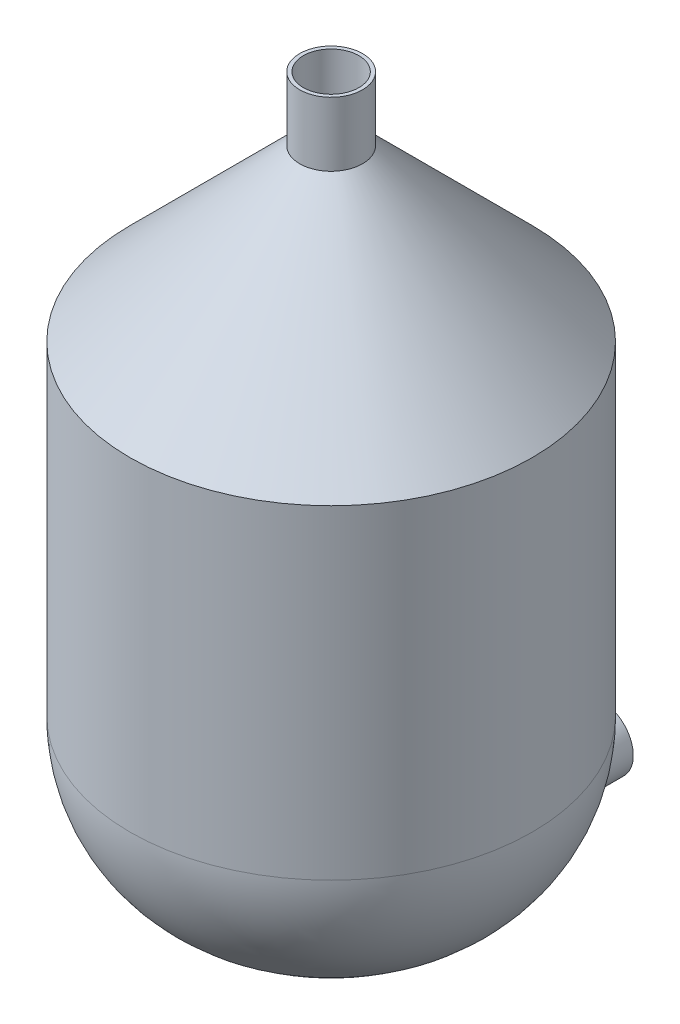
ISO-10303-21;
HEADER;
FILE_DESCRIPTION(('STEP AP214'),'2;1');
FILE_NAME('part.step','',(''),(''),'','','');
FILE_SCHEMA(('AUTOMOTIVE_DESIGN { 1 0 10303 214 1 1 1 1 }'));
ENDSEC;
DATA;
#1=APPLICATION_CONTEXT('core data for automotive mechanical design processes');
#2=APPLICATION_PROTOCOL_DEFINITION('international standard','automotive_design',2000,#1);
#3=PRODUCT_CONTEXT('',#1,'mechanical');
#4=PRODUCT('Part','Part','',(#3));
#5=PRODUCT_RELATED_PRODUCT_CATEGORY('part','',(#4));
#6=PRODUCT_DEFINITION_FORMATION('','',#4);
#7=PRODUCT_DEFINITION_CONTEXT('part definition',#1,'design');
#8=PRODUCT_DEFINITION('design','',#6,#7);
#9=PRODUCT_DEFINITION_SHAPE('','',#8);
#10=(LENGTH_UNIT() NAMED_UNIT(*) SI_UNIT(.MILLI.,.METRE.));
#11=(NAMED_UNIT(*) PLANE_ANGLE_UNIT() SI_UNIT($,.RADIAN.));
#12=(NAMED_UNIT(*) SI_UNIT($,.STERADIAN.) SOLID_ANGLE_UNIT());
#13=UNCERTAINTY_MEASURE_WITH_UNIT(LENGTH_MEASURE(1.E-05),#10,'distance_accuracy_value','');
#14=(GEOMETRIC_REPRESENTATION_CONTEXT(3) GLOBAL_UNCERTAINTY_ASSIGNED_CONTEXT((#13)) GLOBAL_UNIT_ASSIGNED_CONTEXT((#10,
#11,#12)) REPRESENTATION_CONTEXT('',''));
#15=CARTESIAN_POINT('',(0.,0.,0.));
#16=DIRECTION('',(0.,0.,1.));
#17=DIRECTION('',(1.,0.,0.));
#18=AXIS2_PLACEMENT_3D('',#15,#16,#17);
#19=CARTESIAN_POINT('',(3.,51.1307575757577,0.));
#20=DIRECTION('',(0.,-1.,0.));
#21=DIRECTION('',(0.,0.,-1.));
#22=AXIS2_PLACEMENT_3D('',#19,#20,#21);
#23=PLANE('',#22);
#24=CARTESIAN_POINT('',(0.,51.1307575757577,0.));
#25=DIRECTION('',(0.,1.,0.));
#26=DIRECTION('',(0.,0.,1.));
#27=AXIS2_PLACEMENT_3D('',#24,#25,#26);
#28=CIRCLE('',#27,3.);
#29=CARTESIAN_POINT('',(0.,51.1307575757577,3.));
#30=VERTEX_POINT('',#29);
#31=EDGE_CURVE('E139',#30,#30,#28,.T.);
#32=ORIENTED_EDGE('',*,*,#31,.F.);
#33=EDGE_LOOP('',(#32));
#34=FACE_BOUND('',#33,.T.);
#35=CARTESIAN_POINT('',(0.,51.1307575757577,0.));
#36=DIRECTION('',(0.,1.,0.));
#37=DIRECTION('',(0.,0.,1.));
#38=AXIS2_PLACEMENT_3D('',#35,#36,#37);
#39=CIRCLE('',#38,3.395);
#40=CARTESIAN_POINT('',(0.,51.1307575757577,3.395));
#41=VERTEX_POINT('',#40);
#42=EDGE_CURVE('E52',#41,#41,#39,.T.);
#43=ORIENTED_EDGE('',*,*,#42,.T.);
#44=EDGE_LOOP('',(#43));
#45=FACE_BOUND('',#44,.T.);
#46=ADVANCED_FACE('F49',(#34,#45),#23,.F.);
#47=CARTESIAN_POINT('',(0.,65.9453030303031,0.));
#48=DIRECTION('',(0.,1.,0.));
#49=DIRECTION('',(0.,0.,1.));
#50=AXIS2_PLACEMENT_3D('',#47,#48,#49);
#51=CYLINDRICAL_SURFACE('',#50,3.395);
#52=ORIENTED_EDGE('',*,*,#42,.F.);
#53=EDGE_LOOP('',(#52));
#54=FACE_BOUND('',#53,.T.);
#55=CARTESIAN_POINT('',(0.,44.2018253876231,0.));
#56=DIRECTION('',(0.,1.,0.));
#57=DIRECTION('',(0.,0.,1.));
#58=AXIS2_PLACEMENT_3D('',#55,#56,#57);
#59=CIRCLE('',#58,3.395);
#60=CARTESIAN_POINT('',(0.,44.2018253876231,-3.395));
#61=VERTEX_POINT('',#60);
#62=EDGE_CURVE('E62',#61,#61,#59,.T.);
#63=ORIENTED_EDGE('',*,*,#62,.T.);
#64=EDGE_LOOP('',(#63));
#65=FACE_BOUND('',#64,.T.);
#66=ADVANCED_FACE('F129',(#54,#65),#51,.T.);
#67=CARTESIAN_POINT('',(0.,25.8625558773645,0.));
#68=DIRECTION('',(0.,-1.,0.));
#69=DIRECTION('',(0.,0.,-1.));
#70=AXIS2_PLACEMENT_3D('',#67,#68,#69);
#71=CONICAL_SURFACE('',#70,21.7342695102586,0.785398163397447);
#72=CARTESIAN_POINT('',(0.,25.8625558773645,0.));
#73=DIRECTION('',(0.,1.,0.));
#74=DIRECTION('',(0.,0.,1.));
#75=AXIS2_PLACEMENT_3D('',#72,#73,#74);
#76=CIRCLE('',#75,21.7342695102586);
#77=CARTESIAN_POINT('',(0.,25.8625558773645,-21.7342695102586));
#78=VERTEX_POINT('',#77);
#79=EDGE_CURVE('E146',#78,#78,#76,.T.);
#80=CARTESIAN_POINT('',(0.,44.2018253876231,-3.395));
#81=CARTESIAN_POINT('',(0.,44.0107913302246,-3.58603405739853));
#82=CARTESIAN_POINT('',(0.,43.8197572728261,-3.77706811479705));
#83=CARTESIAN_POINT('',(0.,43.437689158029,-4.15913622959411));
#84=CARTESIAN_POINT('',(0.,43.2466551006305,-4.35017028699264));
#85=CARTESIAN_POINT('',(0.,42.8645869858334,-4.73223840178969));
#86=CARTESIAN_POINT('',(0.,42.6735529284349,-4.92327245918821));
#87=CARTESIAN_POINT('',(0.,42.2914848136379,-5.30534057398527));
#88=CARTESIAN_POINT('',(0.,42.1004507562393,-5.49637463138379));
#89=CARTESIAN_POINT('',(0.,41.7183826414423,-5.87844274618085));
#90=CARTESIAN_POINT('',(0.,41.5273485840437,-6.06947680357937));
#91=CARTESIAN_POINT('',(0.,41.1452804692467,-6.45154491837643));
#92=CARTESIAN_POINT('',(0.,40.9542464118482,-6.64257897577496));
#93=CARTESIAN_POINT('',(0.,40.5721782970511,-7.02464709057201));
#94=CARTESIAN_POINT('',(0.,40.3811442396526,-7.21568114797053));
#95=CARTESIAN_POINT('',(0.,39.9990761248555,-7.59774926276759));
#96=CARTESIAN_POINT('',(0.,39.808042067457,-7.78878332016611));
#97=CARTESIAN_POINT('',(0.,39.4259739526599,-8.17085143496317));
#98=CARTESIAN_POINT('',(0.,39.2349398952614,-8.36188549236169));
#99=CARTESIAN_POINT('',(0.,38.8528717804644,-8.74395360715875));
#100=CARTESIAN_POINT('',(0.,38.6618377230658,-8.93498766455727));
#101=CARTESIAN_POINT('',(0.,38.2797696082688,-9.31705577935433));
#102=CARTESIAN_POINT('',(0.,38.0887355508703,-9.50808983675285));
#103=CARTESIAN_POINT('',(0.,37.7066674360732,-9.89015795154991));
#104=CARTESIAN_POINT('',(0.,37.5156333786747,-10.0811920089484));
#105=CARTESIAN_POINT('',(0.,37.1335652638776,-10.4632601237455));
#106=CARTESIAN_POINT('',(0.,36.9425312064791,-10.654294181144));
#107=CARTESIAN_POINT('',(0.,36.560463091682,-11.0363622959411));
#108=CARTESIAN_POINT('',(0.,36.3694290342835,-11.2273963533396));
#109=CARTESIAN_POINT('',(0.,35.9873609194864,-11.6094644681366));
#110=CARTESIAN_POINT('',(0.,35.7963268620879,-11.8004985255352));
#111=CARTESIAN_POINT('',(0.,35.4142587472909,-12.1825666403322));
#112=CARTESIAN_POINT('',(0.,35.2232246898923,-12.3736006977308));
#113=CARTESIAN_POINT('',(0.,34.8411565750953,-12.7556688125278));
#114=CARTESIAN_POINT('',(0.,34.6501225176968,-12.9467028699263));
#115=CARTESIAN_POINT('',(0.,34.2680544028997,-13.3287709847234));
#116=CARTESIAN_POINT('',(0.,34.0770203455012,-13.5198050421219));
#117=CARTESIAN_POINT('',(0.,33.6949522307041,-13.901873156919));
#118=CARTESIAN_POINT('',(0.,33.5039181733056,-14.0929072143175));
#119=CARTESIAN_POINT('',(0.,33.1218500585085,-14.4749753291145));
#120=CARTESIAN_POINT('',(0.,32.93081600111,-14.6660093865131));
#121=CARTESIAN_POINT('',(0.,32.548747886313,-15.0480775013101));
#122=CARTESIAN_POINT('',(0.,32.3577138289144,-15.2391115587087));
#123=CARTESIAN_POINT('',(0.,31.9756457141174,-15.6211796735057));
#124=CARTESIAN_POINT('',(0.,31.7846116567189,-15.8122137309042));
#125=CARTESIAN_POINT('',(0.,31.4025435419218,-16.1942818457013));
#126=CARTESIAN_POINT('',(0.,31.2115094845233,-16.3853159030998));
#127=CARTESIAN_POINT('',(0.,30.8294413697262,-16.7673840178969));
#128=CARTESIAN_POINT('',(0.,30.6384073123277,-16.9584180752954));
#129=CARTESIAN_POINT('',(0.,30.2563391975306,-17.3404861900924));
#130=CARTESIAN_POINT('',(0.,30.0653051401321,-17.531520247491));
#131=CARTESIAN_POINT('',(0.,29.6832370253351,-17.913588362288));
#132=CARTESIAN_POINT('',(0.,29.4922029679365,-18.1046224196866));
#133=CARTESIAN_POINT('',(0.,29.1101348531395,-18.4866905344836));
#134=CARTESIAN_POINT('',(0.,28.9191007957409,-18.6777245918821));
#135=CARTESIAN_POINT('',(0.,28.5370326809439,-19.0597927066792));
#136=CARTESIAN_POINT('',(0.,28.3459986235454,-19.2508267640777));
#137=CARTESIAN_POINT('',(0.,27.9639305087483,-19.6328948788748));
#138=CARTESIAN_POINT('',(0.,27.7728964513498,-19.8239289362733));
#139=CARTESIAN_POINT('',(0.,27.3908283365527,-20.2059970510703));
#140=CARTESIAN_POINT('',(0.,27.1997942791542,-20.3970311084689));
#141=CARTESIAN_POINT('',(0.,26.8177261643571,-20.7790992232659));
#142=CARTESIAN_POINT('',(0.,26.6266921069586,-20.9701332806644));
#143=CARTESIAN_POINT('',(0.,26.2446239921616,-21.3522013954615));
#144=CARTESIAN_POINT('',(0.,26.053589934763,-21.54323545286));
#145=CARTESIAN_POINT('',(0.,25.8625558773645,-21.7342695102586));
#146=B_SPLINE_CURVE_WITH_KNOTS('',3,(#80,#81,#82,#83,#84,#85,#86,#87,#88,#89,#90,#91,#92,#93,
#94,#95,#96,#97,#98,#99,#100,#101,#102,#103,#104,#105,#106,#107,#108,#109,#110,#111,#112,#113,
#114,#115,#116,#117,#118,#119,#120,#121,#122,#123,#124,#125,#126,#127,#128,#129,#130,#131,#132,
#133,#134,#135,#136,#137,#138,#139,#140,#141,#142,#143,#144,#145),.UNSPECIFIED.,.F.,.F.,(4,2,2,
2,2,2,2,2,2,2,2,2,2,2,2,2,2,2,2,2,2,2,2,2,2,2,2,2,2,2,2,2,4),(0.,0.810488864544472,
1.62097772908894,2.43146659363341,3.24195545817788,4.05244432272236,4.86293318726683,
5.6734220518113,6.48391091635577,7.29439978090024,8.10488864544471,8.91537750998918,
9.72586637453365,10.5363552390781,11.3468441036226,12.1573329681671,12.9678218327115,
13.778310697256,14.5887995618005,15.399288426345,16.2097772908894,17.0202661554339,
17.8307550199784,18.6412438845228,19.4517327490673,20.2622216136118,21.0727104781563,
21.8831993427007,22.6936882072452,23.5041770717897,24.3146659363341,25.1251548008786,
25.9356436654231),.UNSPECIFIED.);
#147=EDGE_CURVE('BSEAM134',#61,#78,#146,.T.);
#148=ORIENTED_EDGE('',*,*,#62,.F.);
#149=ORIENTED_EDGE('',*,*,#79,.T.);
#150=ORIENTED_EDGE('',*,*,#147,.T.);
#151=ORIENTED_EDGE('',*,*,#147,.F.);
#152=EDGE_LOOP('',(#148,#150,#149,#151));
#153=FACE_BOUND('',#152,.T.);
#154=ADVANCED_FACE('F134',(#153),#71,.T.);
#155=CARTESIAN_POINT('',(0.,65.9453030303031,0.));
#156=DIRECTION('',(0.,1.,0.));
#157=DIRECTION('',(0.,0.,1.));
#158=AXIS2_PLACEMENT_3D('',#155,#156,#157);
#159=CYLINDRICAL_SURFACE('',#158,21.7342695102586);
#160=ORIENTED_EDGE('',*,*,#79,.F.);
#161=EDGE_LOOP('',(#160));
#162=FACE_BOUND('',#161,.T.);
#163=CARTESIAN_POINT('',(0.,-9.19171364061765,0.));
#164=DIRECTION('',(0.,1.,0.));
#165=DIRECTION('',(0.,0.,1.));
#166=AXIS2_PLACEMENT_3D('',#163,#164,#165);
#167=CIRCLE('',#166,21.7342695102586);
#168=CARTESIAN_POINT('',(0.,-9.19171364061765,21.7342695102586));
#169=VERTEX_POINT('',#168);
#170=EDGE_CURVE('E161',#169,#169,#167,.T.);
#171=ORIENTED_EDGE('',*,*,#170,.T.);
#172=EDGE_LOOP('',(#171));
#173=FACE_BOUND('',#172,.T.);
#174=ADVANCED_FACE('F190',(#162,#173),#159,.T.);
#175=CARTESIAN_POINT('',(0.,65.9453030303031,0.));
#176=DIRECTION('',(0.,1.,0.));
#177=DIRECTION('',(0.,0.,1.));
#178=AXIS2_PLACEMENT_3D('',#175,#176,#177);
#179=CYLINDRICAL_SURFACE('',#178,20.);
#180=CARTESIAN_POINT('',(0.,25.1307575757576,0.));
#181=DIRECTION('',(0.,1.,0.));
#182=DIRECTION('',(0.,0.,1.));
#183=AXIS2_PLACEMENT_3D('',#180,#181,#182);
#184=CIRCLE('',#183,20.);
#185=CARTESIAN_POINT('',(0.,25.1307575757576,-20.));
#186=VERTEX_POINT('',#185);
#187=EDGE_CURVE('E149',#186,#186,#184,.T.);
#188=ORIENTED_EDGE('',*,*,#187,.T.);
#189=EDGE_LOOP('',(#188));
#190=FACE_BOUND('',#189,.T.);
#191=CARTESIAN_POINT('',(0.,-9.19171364061765,0.));
#192=DIRECTION('',(0.,1.,0.));
#193=DIRECTION('',(0.,0.,1.));
#194=AXIS2_PLACEMENT_3D('',#191,#192,#193);
#195=CIRCLE('',#194,20.);
#196=CARTESIAN_POINT('',(0.,-9.19171364061765,20.));
#197=VERTEX_POINT('',#196);
#198=EDGE_CURVE('E88',#197,#197,#195,.T.);
#199=ORIENTED_EDGE('',*,*,#198,.F.);
#200=EDGE_LOOP('',(#199));
#201=FACE_BOUND('',#200,.T.);
#202=ADVANCED_FACE('F187',(#190,#201),#179,.F.);
#203=CARTESIAN_POINT('',(0.,42.1307575757577,0.));
#204=DIRECTION('',(0.,-1.,0.));
#205=DIRECTION('',(0.,0.,-1.));
#206=AXIS2_PLACEMENT_3D('',#203,#204,#205);
#207=CONICAL_SURFACE('',#206,3.,0.785398163397447);
#208=CARTESIAN_POINT('',(0.,42.1307575757577,0.));
#209=DIRECTION('',(0.,1.,0.));
#210=DIRECTION('',(0.,0.,1.));
#211=AXIS2_PLACEMENT_3D('',#208,#209,#210);
#212=CIRCLE('',#211,3.);
#213=CARTESIAN_POINT('',(0.,42.1307575757576,-3.00000000000001));
#214=VERTEX_POINT('',#213);
#215=EDGE_CURVE('E155',#214,#214,#212,.T.);
#216=CARTESIAN_POINT('',(0.,25.1307575757576,-20.));
#217=CARTESIAN_POINT('',(0.,25.3078409090909,-19.8229166666667));
#218=CARTESIAN_POINT('',(0.,25.4849242424243,-19.6458333333333));
#219=CARTESIAN_POINT('',(0.,25.8390909090909,-19.2916666666667));
#220=CARTESIAN_POINT('',(0.,26.0161742424243,-19.1145833333333));
#221=CARTESIAN_POINT('',(0.,26.3703409090909,-18.7604166666667));
#222=CARTESIAN_POINT('',(0.,26.5474242424243,-18.5833333333333));
#223=CARTESIAN_POINT('',(0.,26.901590909091,-18.2291666666667));
#224=CARTESIAN_POINT('',(0.,27.0786742424243,-18.0520833333333));
#225=CARTESIAN_POINT('',(0.,27.432840909091,-17.6979166666667));
#226=CARTESIAN_POINT('',(0.,27.6099242424243,-17.5208333333333));
#227=CARTESIAN_POINT('',(0.,27.964090909091,-17.1666666666667));
#228=CARTESIAN_POINT('',(0.,28.1411742424243,-16.9895833333333));
#229=CARTESIAN_POINT('',(0.,28.495340909091,-16.6354166666667));
#230=CARTESIAN_POINT('',(0.,28.6724242424243,-16.4583333333333));
#231=CARTESIAN_POINT('',(0.,29.026590909091,-16.1041666666667));
#232=CARTESIAN_POINT('',(0.,29.2036742424243,-15.9270833333333));
#233=CARTESIAN_POINT('',(0.,29.557840909091,-15.5729166666667));
#234=CARTESIAN_POINT('',(0.,29.7349242424243,-15.3958333333333));
#235=CARTESIAN_POINT('',(0.,30.089090909091,-15.0416666666667));
#236=CARTESIAN_POINT('',(0.,30.2661742424243,-14.8645833333333));
#237=CARTESIAN_POINT('',(0.,30.620340909091,-14.5104166666667));
#238=CARTESIAN_POINT('',(0.,30.7974242424243,-14.3333333333333));
#239=CARTESIAN_POINT('',(0.,31.151590909091,-13.9791666666667));
#240=CARTESIAN_POINT('',(0.,31.3286742424243,-13.8020833333333));
#241=CARTESIAN_POINT('',(0.,31.682840909091,-13.4479166666667));
#242=CARTESIAN_POINT('',(0.,31.8599242424243,-13.2708333333333));
#243=CARTESIAN_POINT('',(0.,32.214090909091,-12.9166666666667));
#244=CARTESIAN_POINT('',(0.,32.3911742424243,-12.7395833333333));
#245=CARTESIAN_POINT('',(0.,32.745340909091,-12.3854166666667));
#246=CARTESIAN_POINT('',(0.,32.9224242424243,-12.2083333333333));
#247=CARTESIAN_POINT('',(0.,33.276590909091,-11.8541666666667));
#248=CARTESIAN_POINT('',(0.,33.4536742424243,-11.6770833333333));
#249=CARTESIAN_POINT('',(0.,33.807840909091,-11.3229166666667));
#250=CARTESIAN_POINT('',(0.,33.9849242424243,-11.1458333333333));
#251=CARTESIAN_POINT('',(0.,34.339090909091,-10.7916666666667));
#252=CARTESIAN_POINT('',(0.,34.5161742424243,-10.6145833333333));
#253=CARTESIAN_POINT('',(0.,34.870340909091,-10.2604166666667));
#254=CARTESIAN_POINT('',(0.,35.0474242424243,-10.0833333333333));
#255=CARTESIAN_POINT('',(0.,35.401590909091,-9.72916666666667));
#256=CARTESIAN_POINT('',(0.,35.5786742424243,-9.55208333333333));
#257=CARTESIAN_POINT('',(0.,35.932840909091,-9.19791666666667));
#258=CARTESIAN_POINT('',(0.,36.1099242424243,-9.02083333333334));
#259=CARTESIAN_POINT('',(0.,36.464090909091,-8.66666666666667));
#260=CARTESIAN_POINT('',(0.,36.6411742424243,-8.48958333333334));
#261=CARTESIAN_POINT('',(0.,36.995340909091,-8.13541666666667));
#262=CARTESIAN_POINT('',(0.,37.1724242424243,-7.95833333333334));
#263=CARTESIAN_POINT('',(0.,37.526590909091,-7.60416666666667));
#264=CARTESIAN_POINT('',(0.,37.7036742424243,-7.42708333333334));
#265=CARTESIAN_POINT('',(0.,38.057840909091,-7.07291666666667));
#266=CARTESIAN_POINT('',(0.,38.2349242424243,-6.89583333333334));
#267=CARTESIAN_POINT('',(0.,38.589090909091,-6.54166666666667));
#268=CARTESIAN_POINT('',(0.,38.7661742424243,-6.36458333333334));
#269=CARTESIAN_POINT('',(0.,39.120340909091,-6.01041666666667));
#270=CARTESIAN_POINT('',(0.,39.2974242424243,-5.83333333333334));
#271=CARTESIAN_POINT('',(0.,39.651590909091,-5.47916666666667));
#272=CARTESIAN_POINT('',(0.,39.8286742424243,-5.30208333333334));
#273=CARTESIAN_POINT('',(0.,40.182840909091,-4.94791666666667));
#274=CARTESIAN_POINT('',(0.,40.3599242424243,-4.77083333333334));
#275=CARTESIAN_POINT('',(0.,40.714090909091,-4.41666666666667));
#276=CARTESIAN_POINT('',(0.,40.8911742424243,-4.23958333333334));
#277=CARTESIAN_POINT('',(0.,41.245340909091,-3.88541666666667));
#278=CARTESIAN_POINT('',(0.,41.4224242424243,-3.70833333333334));
#279=CARTESIAN_POINT('',(0.,41.776590909091,-3.35416666666667));
#280=CARTESIAN_POINT('',(0.,41.9536742424243,-3.17708333333334));
#281=CARTESIAN_POINT('',(0.,42.1307575757577,-3.00000000000001));
#282=B_SPLINE_CURVE_WITH_KNOTS('',3,(#216,#217,#218,#219,#220,#221,#222,#223,#224,#225,#226,
#227,#228,#229,#230,#231,#232,#233,#234,#235,#236,#237,#238,#239,#240,#241,#242,#243,#244,#245,
#246,#247,#248,#249,#250,#251,#252,#253,#254,#255,#256,#257,#258,#259,#260,#261,#262,#263,#264,
#265,#266,#267,#268,#269,#270,#271,#272,#273,#274,#275,#276,#277,#278,#279,#280,#281),
.UNSPECIFIED.,.F.,.F.,(4,2,2,2,2,2,2,2,2,2,2,2,2,2,2,2,2,2,2,2,2,2,2,2,2,2,2,2,2,2,2,2,4),(0.,
0.751300955010707,1.50260191002141,2.25390286503212,3.00520382004283,3.75650477505354,
4.50780573006424,5.25910668507495,6.01040764008566,6.76170859509637,7.51300955010707,
8.26431050511778,9.01561146012849,9.7669124151392,10.5182133701499,11.2695143251606,
12.0208152801713,12.772116235182,13.5234171901927,14.2747181452034,15.0260191002141,
15.7773200552249,16.5286210102356,17.2799219652463,18.031222920257,18.7825238752677,
19.5338248302784,20.2851257852891,21.0364267402998,21.7877276953105,22.5390286503212,
23.2903296053319,24.0416305603426),.UNSPECIFIED.);
#283=EDGE_CURVE('BSEAM189',#186,#214,#282,.T.);
#284=ORIENTED_EDGE('',*,*,#187,.F.);
#285=ORIENTED_EDGE('',*,*,#215,.T.);
#286=ORIENTED_EDGE('',*,*,#283,.T.);
#287=ORIENTED_EDGE('',*,*,#283,.F.);
#288=EDGE_LOOP('',(#284,#286,#285,#287));
#289=FACE_BOUND('',#288,.T.);
#290=ADVANCED_FACE('F189',(#289),#207,.F.);
#291=CARTESIAN_POINT('',(0.,65.9453030303031,0.));
#292=DIRECTION('',(0.,1.,0.));
#293=DIRECTION('',(0.,0.,1.));
#294=AXIS2_PLACEMENT_3D('',#291,#292,#293);
#295=CYLINDRICAL_SURFACE('',#294,3.);
#296=ORIENTED_EDGE('',*,*,#215,.F.);
#297=EDGE_LOOP('',(#296));
#298=FACE_BOUND('',#297,.T.);
#299=ORIENTED_EDGE('',*,*,#31,.T.);
#300=EDGE_LOOP('',(#299));
#301=FACE_BOUND('',#300,.T.);
#302=ADVANCED_FACE('F197',(#298,#301),#295,.F.);
#303=CARTESIAN_POINT('',(0.,-9.19171364061764,0.));
#304=DIRECTION('',(0.,1.,0.));
#305=DIRECTION('',(0.,0.,1.));
#306=AXIS2_PLACEMENT_3D('',#303,#304,#305);
#307=DEGENERATE_TOROIDAL_SURFACE('',#306,4.02598315087621,17.7082863593824,.T.);
#308=CARTESIAN_POINT('',(0.322836947717065,-26.6698621329476,-6.86404659915029));
#309=CARTESIAN_POINT('',(0.322826730999457,-26.665990404353,-6.88785263179508));
#310=CARTESIAN_POINT('',(0.31909751557241,-26.6620886288803,-6.91170647292842));
#311=CARTESIAN_POINT('',(0.303898645213899,-26.6541896695304,-6.95976216522943));
#312=CARTESIAN_POINT('',(0.291611335047364,-26.6502304630542,-6.98370557218516));
#313=CARTESIAN_POINT('',(0.259474773363451,-26.6428221070527,-7.02833143781953));
#314=CARTESIAN_POINT('',(0.239176902951558,-26.6394244001929,-7.04869106471734));
#315=CARTESIAN_POINT('',(0.190850942650993,-26.6332843327664,-7.08538609498863));
#316=CARTESIAN_POINT('',(0.162159717240476,-26.630685371171,-7.10084953207015));
#317=CARTESIAN_POINT('',(0.0971080179365582,-26.6265798560888,-7.12524711028965));
#318=CARTESIAN_POINT('',(0.0602418303096733,-26.6252938353159,-7.13286469861505));
#319=CARTESIAN_POINT('',(0.00247844125498503,-26.6247048577121,-7.13635400813412));
#320=CARTESIAN_POINT('',(-0.0182785195160861,-26.6247768220779,-7.13592805523481));
#321=CARTESIAN_POINT('',(-0.0594895680613097,-26.6254837311188,-7.1317382032979));
#322=CARTESIAN_POINT('',(-0.079943316640274,-26.6261192640717,-7.12797081632321));
#323=CARTESIAN_POINT('',(-0.120398872307439,-26.6279778296308,-7.11693981822652));
#324=CARTESIAN_POINT('',(-0.140377609879785,-26.6292147668993,-7.10959345146));
#325=CARTESIAN_POINT('',(-0.17857244835023,-26.6322736661166,-7.09139045599564));
#326=CARTESIAN_POINT('',(-0.196794032964268,-26.6340937259536,-7.08054523955197));
#327=CARTESIAN_POINT('',(-0.226493401937831,-26.6377792681403,-7.05852514860404));
#328=CARTESIAN_POINT('',(-0.238530054895787,-26.6395245395869,-7.04808102060141));
#329=CARTESIAN_POINT('',(-0.260670372786324,-26.6433072021381,-7.02539032047958));
#330=CARTESIAN_POINT('',(-0.270778795633966,-26.6453438519274,-7.01314832041402));
#331=CARTESIAN_POINT('',(-0.288698718702981,-26.6496856322496,-6.98697684757918));
#332=CARTESIAN_POINT('',(-0.296492585079726,-26.6519926461032,-6.97303550675399));
#333=CARTESIAN_POINT('',(-0.309231313990265,-26.6567928704526,-6.9439331180301));
#334=CARTESIAN_POINT('',(-0.314178167893123,-26.6592859494212,-6.9287729311442));
#335=CARTESIAN_POINT('',(-0.320516584034415,-26.6640692489572,-6.89958209279858));
#336=CARTESIAN_POINT('',(-0.322253894678737,-26.6663494699081,-6.88562431101318));
#337=CARTESIAN_POINT('',(-0.323171469906447,-26.6709080157037,-6.85762772377914));
#338=CARTESIAN_POINT('',(-0.322352690982253,-26.6731863409387,-6.84358895060003));
#339=CARTESIAN_POINT('',(-0.318335797446152,-26.6775398929766,-6.81667204030265));
#340=CARTESIAN_POINT('',(-0.315276768632213,-26.6796192754718,-6.80377350326929));
#341=CARTESIAN_POINT('',(-0.30709915541502,-26.6836616532696,-6.77861964600977));
#342=CARTESIAN_POINT('',(-0.301977573132786,-26.6856244743669,-6.76636529152747));
#343=CARTESIAN_POINT('',(-0.283336358089109,-26.6914237979445,-6.73004744551544));
#344=CARTESIAN_POINT('',(-0.266713248677406,-26.6950010289647,-6.70748275036078));
#345=CARTESIAN_POINT('',(-0.225684293196486,-26.7015839728391,-6.66575174801781));
#346=CARTESIAN_POINT('',(-0.200621150417815,-26.7044827623106,-6.64723704803732));
#347=CARTESIAN_POINT('',(-0.142671144441973,-26.7094091530559,-6.61566642559435));
#348=CARTESIAN_POINT('',(-0.109183023519644,-26.7112633091569,-6.60370386617007));
#349=CARTESIAN_POINT('',(-0.036108927990511,-26.71357207544,-6.58879976532973));
#350=CARTESIAN_POINT('',(0.00372896879680205,-26.7138343796328,-6.58709792470275));
#351=CARTESIAN_POINT('',(0.0843843726485223,-26.7123942105837,-6.59640606895099));
#352=CARTESIAN_POINT('',(0.125126355900783,-26.7105778193484,-6.60815310254205));
#353=CARTESIAN_POINT('',(0.18035177111354,-26.7062997006874,-6.63559957946043));
#354=CARTESIAN_POINT('',(0.197567443822896,-26.7046496856869,-6.64616315904345));
#355=CARTESIAN_POINT('',(0.229648476946259,-26.7008555771797,-6.67035381359369));
#356=CARTESIAN_POINT('',(0.244517967501136,-26.6987123686077,-6.68397540053704));
#357=CARTESIAN_POINT('',(0.267641410092514,-26.6945801200978,-6.71011641129677));
#358=CARTESIAN_POINT('',(0.276613758383549,-26.6926927213802,-6.72202123082762));
#359=CARTESIAN_POINT('',(0.292429303447308,-26.6886973615804,-6.74713094234337));
#360=CARTESIAN_POINT('',(0.299274938490355,-26.686589656813,-6.76033432248593));
#361=CARTESIAN_POINT('',(0.31073370557492,-26.6821079141908,-6.78830454212503));
#362=CARTESIAN_POINT('',(0.315242622903757,-26.6797264608337,-6.80311348816488));
#363=CARTESIAN_POINT('',(0.321296304235136,-26.6748548387229,-6.83329081731198));
#364=CARTESIAN_POINT('',(0.322843551656963,-26.672364762845,-6.84865872069271));
#365=CARTESIAN_POINT('',(0.322836947717065,-26.6698621329476,-6.86404659915029));
#366=B_SPLINE_CURVE_WITH_KNOTS('',3,(#308,#309,#310,#311,#312,#313,#314,#315,#316,#317,#318,
#319,#320,#321,#322,#323,#324,#325,#326,#327,#328,#329,#330,#331,#332,#333,#334,#335,#336,#337,
#338,#339,#340,#341,#342,#343,#344,#345,#346,#347,#348,#349,#350,#351,#352,#353,#354,#355,#356,
#357,#358,#359,#360,#361,#362,#363,#364,#365),.UNSPECIFIED.,.T.,.F.,(4,2,2,2,2,2,2,2,2,2,2,2,2,
2,2,2,2,2,2,2,2,2,2,2,2,2,2,2,4),(0.,0.072185925645201,0.152430600317766,0.238012728391968,
0.334764016902092,0.445934582640999,0.507993143471896,0.570116560120449,0.633749988350208,
0.697177925961816,0.745077304363847,0.792856917079411,0.840991721216924,0.889092815975448,
0.931616192646738,0.974123658916498,1.01419438907019,1.05432357263068,1.1376802922295,
1.2302535426632,1.33549181415524,1.45322503767836,1.57773240955459,1.63823673269598,
1.69863332824385,1.74352676784591,1.7883685456703,1.83506766920514,1.8817276174103),.UNSPECIFIED.);
#367=CARTESIAN_POINT('',(0.322836947717065,-26.6698621329476,-6.86404659915029));
#368=VERTEX_POINT('',#367);
#369=EDGE_CURVE('E79',#368,#368,#366,.T.);
#370=ORIENTED_EDGE('',*,*,#369,.T.);
#371=EDGE_LOOP('',(#370));
#372=FACE_BOUND('',#371,.T.);
#373=ORIENTED_EDGE('',*,*,#170,.F.);
#374=EDGE_LOOP('',(#373));
#375=FACE_BOUND('',#374,.T.);
#376=CARTESIAN_POINT('',(0.,-26.9,0.));
#377=DIRECTION('',(0.,1.,0.));
#378=DIRECTION('',(0.,0.,1.));
#379=AXIS2_PLACEMENT_3D('',#376,#377,#378);
#380=CIRCLE('',#379,4.02598315087621);
#381=CARTESIAN_POINT('',(0.,-26.9,4.02598315087621));
#382=VERTEX_POINT('',#381);
#383=EDGE_CURVE('E165',#382,#382,#380,.T.);
#384=ORIENTED_EDGE('',*,*,#383,.T.);
#385=EDGE_LOOP('',(#384));
#386=FACE_BOUND('',#385,.T.);
#387=ADVANCED_FACE('F212',(#372,#375,#386),#307,.T.);
#388=CARTESIAN_POINT('',(0.,31.0982532234727,0.));
#389=DIRECTION('',(0.,1.,0.));
#390=DIRECTION('',(0.,0.,1.));
#391=AXIS2_PLACEMENT_3D('',#388,#389,#390);
#392=CYLINDRICAL_SURFACE('',#391,4.0259831508762);
#393=ORIENTED_EDGE('',*,*,#383,.F.);
#394=EDGE_LOOP('',(#393));
#395=FACE_BOUND('',#394,.T.);
#396=CARTESIAN_POINT('',(0.,-22.8630198088506,0.));
#397=DIRECTION('',(0.,1.,0.));
#398=DIRECTION('',(0.,0.,1.));
#399=AXIS2_PLACEMENT_3D('',#396,#397,#398);
#400=CIRCLE('',#399,4.0259831508762);
#401=CARTESIAN_POINT('',(0.,-22.8630198088506,4.0259831508762));
#402=VERTEX_POINT('',#401);
#403=EDGE_CURVE('E169',#402,#402,#400,.T.);
#404=ORIENTED_EDGE('',*,*,#403,.T.);
#405=EDGE_LOOP('',(#404));
#406=FACE_BOUND('',#405,.T.);
#407=ADVANCED_FACE('F215',(#395,#406),#392,.F.);
#408=CARTESIAN_POINT('',(4.0259831508762,-22.8630198088506,0.));
#409=DIRECTION('',(0.,-1.,0.));
#410=DIRECTION('',(0.,0.,-1.));
#411=AXIS2_PLACEMENT_3D('',#408,#409,#410);
#412=PLANE('',#411);
#413=ORIENTED_EDGE('',*,*,#403,.F.);
#414=EDGE_LOOP('',(#413));
#415=FACE_BOUND('',#414,.T.);
#416=CARTESIAN_POINT('',(0.,-22.8630198088506,0.));
#417=DIRECTION('',(0.,1.,0.));
#418=DIRECTION('',(0.,0.,1.));
#419=AXIS2_PLACEMENT_3D('',#416,#417,#418);
#420=CIRCLE('',#419,5.42963693755476);
#421=CARTESIAN_POINT('',(0.,-22.8630198088506,5.42963693755476));
#422=VERTEX_POINT('',#421);
#423=EDGE_CURVE('E173',#422,#422,#420,.T.);
#424=ORIENTED_EDGE('',*,*,#423,.T.);
#425=EDGE_LOOP('',(#424));
#426=FACE_BOUND('',#425,.T.);
#427=ADVANCED_FACE('F222',(#415,#426),#412,.F.);
#428=CARTESIAN_POINT('',(0.,31.0982532234727,0.));
#429=DIRECTION('',(0.,1.,0.));
#430=DIRECTION('',(0.,0.,1.));
#431=AXIS2_PLACEMENT_3D('',#428,#429,#430);
#432=CYLINDRICAL_SURFACE('',#431,5.42963693755476);
#433=ORIENTED_EDGE('',*,*,#423,.F.);
#434=EDGE_LOOP('',(#433));
#435=FACE_BOUND('',#434,.T.);
#436=CARTESIAN_POINT('',(0.,-25.1039407111202,0.));
#437=DIRECTION('',(0.,1.,0.));
#438=DIRECTION('',(0.,0.,1.));
#439=AXIS2_PLACEMENT_3D('',#436,#437,#438);
#440=CIRCLE('',#439,5.42963693755477);
#441=CARTESIAN_POINT('',(0.,-25.1039407111202,5.42963693755477));
#442=VERTEX_POINT('',#441);
#443=EDGE_CURVE('E176',#442,#442,#440,.T.);
#444=ORIENTED_EDGE('',*,*,#443,.T.);
#445=EDGE_LOOP('',(#444));
#446=FACE_BOUND('',#445,.T.);
#447=ADVANCED_FACE('F228',(#435,#446),#432,.T.);
#448=CARTESIAN_POINT('',(0.,-9.19171364061765,0.));
#449=DIRECTION('',(0.,1.,0.));
#450=DIRECTION('',(0.,0.,1.));
#451=AXIS2_PLACEMENT_3D('',#448,#449,#450);
#452=DEGENERATE_TOROIDAL_SURFACE('',#451,4.0259831508762,15.9740168491238,.T.);
#453=ORIENTED_EDGE('',*,*,#443,.F.);
#454=EDGE_LOOP('',(#453));
#455=FACE_BOUND('',#454,.T.);
#456=ORIENTED_EDGE('',*,*,#198,.T.);
#457=EDGE_LOOP('',(#456));
#458=FACE_BOUND('',#457,.T.);
#459=ADVANCED_FACE('F185',(#455,#458),#452,.F.);
#460=CARTESIAN_POINT('',(0.322836947717065,-25.723748737745,-5.84525663639689));
#461=CARTESIAN_POINT('',(0.322836947717065,-26.5122977912679,-6.66298888829619));
#462=CARTESIAN_POINT('',(0.322836947717065,-27.2325304939063,-7.4763442888078));
#463=CARTESIAN_POINT('',(0.322836947717065,-28.4479224110263,-9.08863521523556));
#464=CARTESIAN_POINT('',(0.322836947717065,-28.9549985529685,-9.88833422778692));
#465=CARTESIAN_POINT('',(0.322836947717065,-30.1743675288927,-12.2680919134678));
#466=CARTESIAN_POINT('',(0.322836947717065,-30.5848009130089,-13.8288112346113));
#467=CARTESIAN_POINT('',(0.322836947717065,-30.6007091482058,-16.8986782715984));
#468=CARTESIAN_POINT('',(0.322836947717065,-30.2061839993005,-18.4078259874558));
#469=CARTESIAN_POINT('',(0.322836947717065,-28.6121751684702,-21.3745498138867));
#470=CARTESIAN_POINT('',(0.322836947717065,-27.412691486536,-22.8321259244645));
#471=CARTESIAN_POINT('',(0.322836947717065,-25.8107285381104,-24.2639162323796));
#472=CARTESIAN_POINT('',(0.322836947717065,-25.7481934061515,-6.49046763865241));
#473=CARTESIAN_POINT('',(0.322836947717065,-26.5235602241799,-7.30869931706995));
#474=CARTESIAN_POINT('',(0.322836947717065,-27.2112241174291,-8.12248967917104));
#475=CARTESIAN_POINT('',(0.322836947717065,-28.3616339462038,-9.72934741882201));
#476=CARTESIAN_POINT('',(0.322836947717065,-28.8320630815662,-10.5235752053437));
#477=CARTESIAN_POINT('',(0.322836947717065,-29.9300373557044,-12.8715779087433));
#478=CARTESIAN_POINT('',(0.322836947717065,-30.2415407512226,-14.3871996144895));
#479=CARTESIAN_POINT('',(0.322836947717065,-30.0884219916481,-17.3075633293037));
#480=CARTESIAN_POINT('',(0.322836947717065,-29.6313061763505,-18.7163697346861));
#481=CARTESIAN_POINT('',(0.322836947717065,-27.9732870624529,-21.5068590882617));
#482=CARTESIAN_POINT('',(0.322836947717065,-26.7670175909062,-22.8897118022246));
#483=CARTESIAN_POINT('',(0.322836947717065,-25.1650546426763,-24.2639162323796));
#484=CARTESIAN_POINT('',(-0.322836947717065,-25.7481934061515,-6.49046763865241));
#485=CARTESIAN_POINT('',(-0.322836947717065,-26.5235602241799,-7.30869931706995));
#486=CARTESIAN_POINT('',(-0.322836947717065,-27.2112241174291,-8.12248967917104));
#487=CARTESIAN_POINT('',(-0.322836947717065,-28.3616339462038,-9.72934741882201));
#488=CARTESIAN_POINT('',(-0.322836947717065,-28.8320630815662,-10.5235752053437));
#489=CARTESIAN_POINT('',(-0.322836947717065,-29.9300373557044,-12.8715779087433));
#490=CARTESIAN_POINT('',(-0.322836947717065,-30.2415407512226,-14.3871996144895));
#491=CARTESIAN_POINT('',(-0.322836947717065,-30.0884219916481,-17.3075633293037));
#492=CARTESIAN_POINT('',(-0.322836947717065,-29.6313061763505,-18.7163697346861));
#493=CARTESIAN_POINT('',(-0.322836947717065,-27.9732870624529,-21.5068590882617));
#494=CARTESIAN_POINT('',(-0.322836947717065,-26.7670175909062,-22.8897118022246));
#495=CARTESIAN_POINT('',(-0.322836947717065,-25.1650546426763,-24.2639162323796));
#496=CARTESIAN_POINT('',(-0.322836947717065,-25.723748737745,-5.84525663639689));
#497=CARTESIAN_POINT('',(-0.322836947717065,-26.5122977912679,-6.66298888829619));
#498=CARTESIAN_POINT('',(-0.322836947717065,-27.2325304939063,-7.4763442888078));
#499=CARTESIAN_POINT('',(-0.322836947717065,-28.4479224110263,-9.08863521523556));
#500=CARTESIAN_POINT('',(-0.322836947717065,-28.9549985529685,-9.88833422778692));
#501=CARTESIAN_POINT('',(-0.322836947717065,-30.1743675288927,-12.2680919134678));
#502=CARTESIAN_POINT('',(-0.322836947717065,-30.5848009130089,-13.8288112346113));
#503=CARTESIAN_POINT('',(-0.322836947717065,-30.6007091482058,-16.8986782715984));
#504=CARTESIAN_POINT('',(-0.322836947717065,-30.2061839993005,-18.4078259874558));
#505=CARTESIAN_POINT('',(-0.322836947717065,-28.6121751684702,-21.3745498138867));
#506=CARTESIAN_POINT('',(-0.322836947717065,-27.412691486536,-22.8321259244645));
#507=CARTESIAN_POINT('',(-0.322836947717065,-25.8107285381104,-24.2639162323796));
#508=CARTESIAN_POINT('',(-0.322836947717065,-25.6993040693385,-5.20004563414137));
#509=CARTESIAN_POINT('',(-0.322836947717065,-26.501035358356,-6.01727845952244));
#510=CARTESIAN_POINT('',(-0.322836947717065,-27.2538368703836,-6.83019889844456));
#511=CARTESIAN_POINT('',(-0.322836947717065,-28.5342108758489,-8.44792301164911));
#512=CARTESIAN_POINT('',(-0.322836947717065,-29.0779340243708,-9.25309325023014));
#513=CARTESIAN_POINT('',(-0.322836947717065,-30.418697702081,-11.6646059181924));
#514=CARTESIAN_POINT('',(-0.322836947717065,-30.9280610747952,-13.2704228547331));
#515=CARTESIAN_POINT('',(-0.322836947717065,-31.1129963047635,-16.4897932138931));
#516=CARTESIAN_POINT('',(-0.322836947717065,-30.7810618222504,-18.0992822402255));
#517=CARTESIAN_POINT('',(-0.322836947717065,-29.2510632744875,-21.2422405395116));
#518=CARTESIAN_POINT('',(-0.322836947717065,-28.0583653821658,-22.7745400467044));
#519=CARTESIAN_POINT('',(-0.322836947717065,-26.4564024335446,-24.2639162323796));
#520=CARTESIAN_POINT('',(0.322836947717065,-25.6993040693385,-5.20004563414137));
#521=CARTESIAN_POINT('',(0.322836947717065,-26.501035358356,-6.01727845952244));
#522=CARTESIAN_POINT('',(0.322836947717065,-27.2538368703836,-6.83019889844456));
#523=CARTESIAN_POINT('',(0.322836947717065,-28.5342108758489,-8.44792301164911));
#524=CARTESIAN_POINT('',(0.322836947717065,-29.0779340243708,-9.25309325023014));
#525=CARTESIAN_POINT('',(0.322836947717065,-30.418697702081,-11.6646059181924));
#526=CARTESIAN_POINT('',(0.322836947717065,-30.9280610747952,-13.2704228547331));
#527=CARTESIAN_POINT('',(0.322836947717065,-31.1129963047635,-16.4897932138931));
#528=CARTESIAN_POINT('',(0.322836947717065,-30.7810618222504,-18.0992822402255));
#529=CARTESIAN_POINT('',(0.322836947717065,-29.2510632744875,-21.2422405395116));
#530=CARTESIAN_POINT('',(0.322836947717065,-28.0583653821658,-22.7745400467044));
#531=CARTESIAN_POINT('',(0.322836947717065,-26.4564024335446,-24.2639162323796));
#532=CARTESIAN_POINT('',(0.322836947717065,-25.723748737745,-5.84525663639689));
#533=CARTESIAN_POINT('',(0.322836947717065,-26.5122977912679,-6.66298888829619));
#534=CARTESIAN_POINT('',(0.322836947717065,-27.2325304939063,-7.4763442888078));
#535=CARTESIAN_POINT('',(0.322836947717065,-28.4479224110263,-9.08863521523556));
#536=CARTESIAN_POINT('',(0.322836947717065,-28.9549985529685,-9.88833422778692));
#537=CARTESIAN_POINT('',(0.322836947717065,-30.1743675288927,-12.2680919134678));
#538=CARTESIAN_POINT('',(0.322836947717065,-30.5848009130089,-13.8288112346113));
#539=CARTESIAN_POINT('',(0.322836947717065,-30.6007091482058,-16.8986782715984));
#540=CARTESIAN_POINT('',(0.322836947717065,-30.2061839993005,-18.4078259874558));
#541=CARTESIAN_POINT('',(0.322836947717065,-28.6121751684702,-21.3745498138867));
#542=CARTESIAN_POINT('',(0.322836947717065,-27.412691486536,-22.8321259244645));
#543=CARTESIAN_POINT('',(0.322836947717065,-25.8107285381104,-24.2639162323796));
#544=(BOUNDED_SURFACE() B_SPLINE_SURFACE(3,3,((#460,#461,#462,#463,#464,#465,#466,#467,#468,
#469,#470,#471),(#472,#473,#474,#475,#476,#477,#478,#479,#480,#481,#482,#483),(#484,#485,#486,
#487,#488,#489,#490,#491,#492,#493,#494,#495),(#496,#497,#498,#499,#500,#501,#502,#503,#504,
#505,#506,#507),(#508,#509,#510,#511,#512,#513,#514,#515,#516,#517,#518,#519),(#520,#521,#522,
#523,#524,#525,#526,#527,#528,#529,#530,#531),(#532,#533,#534,#535,#536,#537,#538,#539,#540,
#541,#542,#543)),.UNSPECIFIED.,.T.,.F.,.F.) B_SPLINE_SURFACE_WITH_KNOTS((4,3,4),(4,2,2,2,2,4),
(0.,0.5,1.),(0.,0.125,0.25,0.5,0.75,1.),
.UNSPECIFIED.) GEOMETRIC_REPRESENTATION_ITEM() RATIONAL_B_SPLINE_SURFACE(((1.,1.,1.,1.,1.,1.,1.,
1.,1.,1.,1.,1.),(0.333333333333333,0.333333333333333,0.333333333333333,0.333333333333333,
0.333333333333333,0.333333333333333,0.333333333333333,0.333333333333333,0.333333333333333,
0.333333333333333,0.333333333333333,0.333333333333333),(0.333333333333333,0.333333333333333,
0.333333333333333,0.333333333333333,0.333333333333333,0.333333333333333,0.333333333333333,
0.333333333333333,0.333333333333333,0.333333333333333,0.333333333333333,0.333333333333333),(1.,
1.,1.,1.,1.,1.,1.,1.,1.,1.,1.,1.),(0.333333333333333,0.333333333333333,0.333333333333333,
0.333333333333333,0.333333333333333,0.333333333333333,0.333333333333333,0.333333333333333,
0.333333333333333,0.333333333333333,0.333333333333333,0.333333333333333),(0.333333333333333,
0.333333333333333,0.333333333333333,0.333333333333333,0.333333333333333,0.333333333333333,
0.333333333333333,0.333333333333333,0.333333333333333,0.333333333333333,0.333333333333333,
0.333333333333333),(1.,1.,1.,1.,1.,1.,1.,1.,1.,1.,1.,1.))) REPRESENTATION_ITEM('') SURFACE());
#545=CARTESIAN_POINT('',(0.,-25.8107285381104,-24.2639162323796));
#546=DIRECTION('',(0.,0.,1.));
#547=DIRECTION('',(1.,0.,0.));
#548=AXIS2_PLACEMENT_3D('',#545,#546,#547);
#549=CIRCLE('',#548,0.322836947717065);
#550=CARTESIAN_POINT('',(0.322836947717065,-25.8107285381104,-24.2639162323796));
#551=VERTEX_POINT('',#550);
#552=EDGE_CURVE('E71',#551,#551,#549,.T.);
#553=ORIENTED_EDGE('',*,*,#552,.T.);
#554=EDGE_LOOP('',(#553));
#555=FACE_BOUND('',#554,.T.);
#556=ORIENTED_EDGE('',*,*,#369,.F.);
#557=EDGE_LOOP('',(#556));
#558=FACE_BOUND('',#557,.T.);
#559=ADVANCED_FACE('F90',(#555,#558),#544,.F.);
#560=CARTESIAN_POINT('',(0.,-25.8107285381104,-25.2639162323796));
#561=DIRECTION('',(0.,0.,1.));
#562=DIRECTION('',(1.,0.,0.));
#563=AXIS2_PLACEMENT_3D('',#560,#561,#562);
#564=CYLINDRICAL_SURFACE('',#563,4.);
#565=CARTESIAN_POINT('',(0.,-25.8107285381104,-25.2639162323796));
#566=DIRECTION('',(0.,0.,-1.));
#567=DIRECTION('',(-1.,0.,0.));
#568=AXIS2_PLACEMENT_3D('',#565,#566,#567);
#569=CIRCLE('',#568,4.);
#570=CARTESIAN_POINT('',(-4.,-25.8107285381104,-25.2639162323796));
#571=VERTEX_POINT('',#570);
#572=EDGE_CURVE('E67',#571,#571,#569,.T.);
#573=ORIENTED_EDGE('',*,*,#572,.F.);
#574=EDGE_LOOP('',(#573));
#575=FACE_BOUND('',#574,.T.);
#576=CARTESIAN_POINT('',(0.,-25.8107285381104,-24.2639162323796));
#577=DIRECTION('',(0.,0.,-1.));
#578=DIRECTION('',(-1.,0.,0.));
#579=AXIS2_PLACEMENT_3D('',#576,#577,#578);
#580=CIRCLE('',#579,4.);
#581=CARTESIAN_POINT('',(-4.,-25.8107285381104,-24.2639162323796));
#582=VERTEX_POINT('',#581);
#583=EDGE_CURVE('E72',#582,#582,#580,.T.);
#584=ORIENTED_EDGE('',*,*,#583,.T.);
#585=EDGE_LOOP('',(#584));
#586=FACE_BOUND('',#585,.T.);
#587=ADVANCED_FACE('F97',(#575,#586),#564,.T.);
#588=CARTESIAN_POINT('',(0.,-25.8107285381104,-25.2639162323796));
#589=DIRECTION('',(0.,0.,-1.));
#590=DIRECTION('',(-1.,0.,0.));
#591=AXIS2_PLACEMENT_3D('',#588,#589,#590);
#592=PLANE('',#591);
#593=CARTESIAN_POINT('',(0.,-25.8107285381104,-25.2639162323796));
#594=DIRECTION('',(0.,0.,-1.));
#595=DIRECTION('',(-1.,0.,0.));
#596=AXIS2_PLACEMENT_3D('',#593,#594,#595);
#597=CIRCLE('',#596,3.395);
#598=CARTESIAN_POINT('',(-3.395,-25.8107285381104,-25.2639162323796));
#599=VERTEX_POINT('',#598);
#600=EDGE_CURVE('E10',#599,#599,#597,.T.);
#601=ORIENTED_EDGE('',*,*,#600,.F.);
#602=EDGE_LOOP('',(#601));
#603=FACE_BOUND('',#602,.T.);
#604=ORIENTED_EDGE('',*,*,#572,.T.);
#605=EDGE_LOOP('',(#604));
#606=FACE_BOUND('',#605,.T.);
#607=ADVANCED_FACE('F100',(#603,#606),#592,.T.);
#608=CARTESIAN_POINT('',(0.,-25.8107285381104,-24.2639162323796));
#609=DIRECTION('',(0.,0.,-1.));
#610=DIRECTION('',(-1.,0.,0.));
#611=AXIS2_PLACEMENT_3D('',#608,#609,#610);
#612=PLANE('',#611);
#613=ORIENTED_EDGE('',*,*,#552,.F.);
#614=EDGE_LOOP('',(#613));
#615=FACE_BOUND('',#614,.T.);
#616=ORIENTED_EDGE('',*,*,#583,.F.);
#617=EDGE_LOOP('',(#616));
#618=FACE_BOUND('',#617,.T.);
#619=ADVANCED_FACE('F102',(#615,#618),#612,.F.);
#620=CARTESIAN_POINT('',(0.,-25.8107285381104,-29.2639162323796));
#621=DIRECTION('',(0.,0.,1.));
#622=DIRECTION('',(1.,0.,0.));
#623=AXIS2_PLACEMENT_3D('',#620,#621,#622);
#624=CYLINDRICAL_SURFACE('',#623,3.395);
#625=CARTESIAN_POINT('',(0.,-25.8107285381104,-29.2639162323796));
#626=DIRECTION('',(0.,0.,-1.));
#627=DIRECTION('',(-1.,0.,0.));
#628=AXIS2_PLACEMENT_3D('',#625,#626,#627);
#629=CIRCLE('',#628,3.395);
#630=CARTESIAN_POINT('',(-3.395,-25.8107285381104,-29.2639162323796));
#631=VERTEX_POINT('',#630);
#632=EDGE_CURVE('E65',#631,#631,#629,.T.);
#633=ORIENTED_EDGE('',*,*,#632,.F.);
#634=EDGE_LOOP('',(#633));
#635=FACE_BOUND('',#634,.T.);
#636=ORIENTED_EDGE('',*,*,#600,.T.);
#637=EDGE_LOOP('',(#636));
#638=FACE_BOUND('',#637,.T.);
#639=ADVANCED_FACE('F105',(#635,#638),#624,.T.);
#640=CARTESIAN_POINT('',(0.,-25.8107285381104,-29.2639162323796));
#641=DIRECTION('',(0.,0.,-1.));
#642=DIRECTION('',(-1.,0.,0.));
#643=AXIS2_PLACEMENT_3D('',#640,#641,#642);
#644=PLANE('',#643);
#645=CARTESIAN_POINT('',(0.,-25.8107285381104,-29.2639162323796));
#646=DIRECTION('',(0.,0.,-1.));
#647=DIRECTION('',(-1.,0.,0.));
#648=AXIS2_PLACEMENT_3D('',#645,#646,#647);
#649=CIRCLE('',#648,2.40929695872948);
#650=CARTESIAN_POINT('',(-2.40929695872948,-25.8107285381104,-29.2639162323796));
#651=VERTEX_POINT('',#650);
#652=EDGE_CURVE('E489',#651,#651,#649,.T.);
#653=ORIENTED_EDGE('',*,*,#652,.F.);
#654=EDGE_LOOP('',(#653));
#655=FACE_BOUND('',#654,.T.);
#656=ORIENTED_EDGE('',*,*,#632,.T.);
#657=EDGE_LOOP('',(#656));
#658=FACE_BOUND('',#657,.T.);
#659=ADVANCED_FACE('F112',(#655,#658),#644,.T.);
#660=CARTESIAN_POINT('',(0.,-25.8107285381104,-25.2639162323796));
#661=DIRECTION('',(0.,0.,-1.));
#662=DIRECTION('',(-1.,0.,0.));
#663=AXIS2_PLACEMENT_3D('',#660,#661,#662);
#664=CYLINDRICAL_SURFACE('',#663,2.40929695872948);
#665=CARTESIAN_POINT('',(0.,-25.8107285381104,-25.2639162323796));
#666=DIRECTION('',(0.,0.,-1.));
#667=DIRECTION('',(-1.,0.,0.));
#668=AXIS2_PLACEMENT_3D('',#665,#666,#667);
#669=CIRCLE('',#668,2.40929695872948);
#670=CARTESIAN_POINT('',(-2.40929695872948,-25.8107285381104,-25.2639162323796));
#671=VERTEX_POINT('',#670);
#672=EDGE_CURVE('E487',#671,#671,#669,.T.);
#673=ORIENTED_EDGE('',*,*,#672,.F.);
#674=EDGE_LOOP('',(#673));
#675=FACE_BOUND('',#674,.T.);
#676=ORIENTED_EDGE('',*,*,#652,.T.);
#677=EDGE_LOOP('',(#676));
#678=FACE_BOUND('',#677,.T.);
#679=ADVANCED_FACE('F116',(#675,#678),#664,.F.);
#680=CARTESIAN_POINT('',(0.,-25.8107285381104,-25.2639162323796));
#681=DIRECTION('',(0.,0.,-1.));
#682=DIRECTION('',(-1.,0.,0.));
#683=AXIS2_PLACEMENT_3D('',#680,#681,#682);
#684=PLANE('',#683);
#685=ORIENTED_EDGE('',*,*,#672,.T.);
#686=EDGE_LOOP('',(#685));
#687=FACE_BOUND('',#686,.T.);
#688=ADVANCED_FACE('F120',(#687),#684,.T.);
#689=CLOSED_SHELL('',(#46,#66,#154,#174,#202,#290,#302,#387,#407,#427,#447,#459,#559,#587,#607,
#619,#639,#659,#679,#688));
#690=MANIFOLD_SOLID_BREP('B2',#689);
#691=ADVANCED_BREP_SHAPE_REPRESENTATION('',(#18,#690),#14);
#692=SHAPE_DEFINITION_REPRESENTATION(#9,#691);
ENDSEC;
END-ISO-10303-21;
